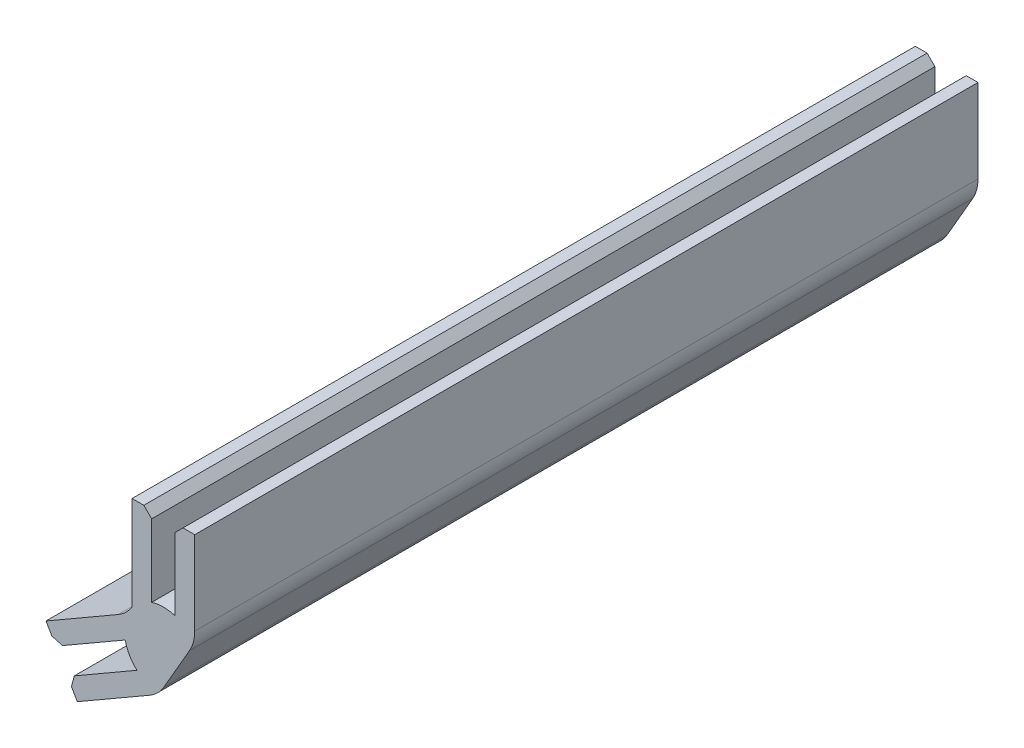
ISO-10303-21;
HEADER;
FILE_DESCRIPTION(('STEP AP214'),'2;1');
FILE_NAME('part.step','',(''),(''),'','','');
FILE_SCHEMA(('AUTOMOTIVE_DESIGN { 1 0 10303 214 1 1 1 1 }'));
ENDSEC;
DATA;
#1=APPLICATION_CONTEXT('core data for automotive mechanical design processes');
#2=APPLICATION_PROTOCOL_DEFINITION('international standard','automotive_design',2000,#1);
#3=PRODUCT_CONTEXT('',#1,'mechanical');
#4=PRODUCT('Part','Part','',(#3));
#5=PRODUCT_RELATED_PRODUCT_CATEGORY('part','',(#4));
#6=PRODUCT_DEFINITION_FORMATION('','',#4);
#7=PRODUCT_DEFINITION_CONTEXT('part definition',#1,'design');
#8=PRODUCT_DEFINITION('design','',#6,#7);
#9=PRODUCT_DEFINITION_SHAPE('','',#8);
#10=(LENGTH_UNIT() NAMED_UNIT(*) SI_UNIT(.MILLI.,.METRE.));
#11=(NAMED_UNIT(*) PLANE_ANGLE_UNIT() SI_UNIT($,.RADIAN.));
#12=(NAMED_UNIT(*) SI_UNIT($,.STERADIAN.) SOLID_ANGLE_UNIT());
#13=UNCERTAINTY_MEASURE_WITH_UNIT(LENGTH_MEASURE(1.E-05),#10,'distance_accuracy_value','');
#14=(GEOMETRIC_REPRESENTATION_CONTEXT(3) GLOBAL_UNCERTAINTY_ASSIGNED_CONTEXT((#13)) GLOBAL_UNIT_ASSIGNED_CONTEXT((#10,
#11,#12)) REPRESENTATION_CONTEXT('',''));
#15=CARTESIAN_POINT('',(0.,0.,0.));
#16=DIRECTION('',(0.,0.,1.));
#17=DIRECTION('',(1.,0.,0.));
#18=AXIS2_PLACEMENT_3D('',#15,#16,#17);
#19=CARTESIAN_POINT('',(0.,0.,100.));
#20=DIRECTION('',(0.,0.,-1.));
#21=DIRECTION('',(-1.,0.,0.));
#22=AXIS2_PLACEMENT_3D('',#19,#20,#21);
#23=CYLINDRICAL_SURFACE('',#22,5.);
#24=CARTESIAN_POINT('',(0.,0.,0.));
#25=DIRECTION('',(0.,0.,1.));
#26=DIRECTION('',(1.,0.,0.));
#27=AXIS2_PLACEMENT_3D('',#24,#25,#26);
#28=CIRCLE('',#27,5.);
#29=CARTESIAN_POINT('',(-4.,3.,0.));
#30=VERTEX_POINT('',#29);
#31=CARTESIAN_POINT('',(-4.1374586088177,2.80738958114478,0.));
#32=VERTEX_POINT('',#31);
#33=EDGE_CURVE('E260',#30,#32,#28,.T.);
#34=ORIENTED_EDGE('',*,*,#33,.T.);
#35=DIRECTION('',(0.,0.,-1.));
#36=VECTOR('',#35,1.);
#37=CARTESIAN_POINT('',(-4.1374586088177,2.80738958114478,100.));
#38=LINE('',#37,#36);
#39=CARTESIAN_POINT('',(-4.1374586088177,2.80738958114478,100.));
#40=VERTEX_POINT('',#39);
#41=EDGE_CURVE('E335',#32,#40,#38,.F.);
#42=ORIENTED_EDGE('',*,*,#41,.T.);
#43=CARTESIAN_POINT('',(0.,0.,100.));
#44=DIRECTION('',(0.,0.,1.));
#45=DIRECTION('',(1.,0.,0.));
#46=AXIS2_PLACEMENT_3D('',#43,#44,#45);
#47=CIRCLE('',#46,5.);
#48=CARTESIAN_POINT('',(-4.,3.,100.));
#49=VERTEX_POINT('',#48);
#50=EDGE_CURVE('E215',#49,#40,#47,.T.);
#51=ORIENTED_EDGE('',*,*,#50,.F.);
#52=DIRECTION('',(0.,0.,-1.));
#53=VECTOR('',#52,1.);
#54=CARTESIAN_POINT('',(-4.,3.,100.));
#55=LINE('',#54,#53);
#56=EDGE_CURVE('E257',#49,#30,#55,.T.);
#57=ORIENTED_EDGE('',*,*,#56,.T.);
#58=EDGE_LOOP('',(#34,#42,#51,#57));
#59=FACE_BOUND('',#58,.T.);
#60=ADVANCED_FACE('F43',(#59),#23,.T.);
#61=CARTESIAN_POINT('',(-4.59807621135333,1.96410161513773,100.));
#62=DIRECTION('',(0.500000000000004,-0.866025403784436,0.));
#63=DIRECTION('',(0.866025403784436,0.500000000000004,0.));
#64=AXIS2_PLACEMENT_3D('',#61,#62,#63);
#65=PLANE('',#64);
#66=DIRECTION('',(-0.866025403784436,-0.500000000000004,0.));
#67=VECTOR('',#66,1.);
#68=CARTESIAN_POINT('',(-4.59807621135333,1.96410161513773,100.));
#69=LINE('',#68,#67);
#70=CARTESIAN_POINT('',(-5.77491721763539,1.28465214336739,100.));
#71=VERTEX_POINT('',#70);
#72=CARTESIAN_POINT('',(-14.9903810567666,-4.03589838486232,100.));
#73=VERTEX_POINT('',#72);
#74=EDGE_CURVE('E197',#71,#73,#69,.T.);
#75=ORIENTED_EDGE('',*,*,#74,.F.);
#76=DIRECTION('',(0.,0.,1.));
#77=VECTOR('',#76,1.);
#78=CARTESIAN_POINT('',(-5.77491721763539,1.28465214336739,0.));
#79=LINE('',#78,#77);
#80=CARTESIAN_POINT('',(-5.77491721763539,1.28465214336739,0.));
#81=VERTEX_POINT('',#80);
#82=EDGE_CURVE('E329',#71,#81,#79,.F.);
#83=ORIENTED_EDGE('',*,*,#82,.T.);
#84=DIRECTION('',(-0.866025403784436,-0.500000000000004,0.));
#85=VECTOR('',#84,1.);
#86=CARTESIAN_POINT('',(-4.59807621135333,1.96410161513773,0.));
#87=LINE('',#86,#85);
#88=CARTESIAN_POINT('',(-14.9903810567666,-4.03589838486232,0.));
#89=VERTEX_POINT('',#88);
#90=EDGE_CURVE('E216',#81,#89,#87,.T.);
#91=ORIENTED_EDGE('',*,*,#90,.T.);
#92=DIRECTION('',(0.,0.,-1.));
#93=VECTOR('',#92,1.);
#94=CARTESIAN_POINT('',(-14.9903810567666,-4.03589838486232,100.));
#95=LINE('',#94,#93);
#96=EDGE_CURVE('E213',#73,#89,#95,.T.);
#97=ORIENTED_EDGE('',*,*,#96,.F.);
#98=EDGE_LOOP('',(#75,#83,#91,#97));
#99=FACE_BOUND('',#98,.T.);
#100=ADVANCED_FACE('F218',(#99),#65,.F.);
#101=CARTESIAN_POINT('',(-14.9903810567666,-4.03589838486232,100.));
#102=DIRECTION('',(0.866025403784436,0.500000000000004,0.));
#103=DIRECTION('',(-0.500000000000004,0.866025403784436,0.));
#104=AXIS2_PLACEMENT_3D('',#101,#102,#103);
#105=PLANE('',#104);
#106=DIRECTION('',(0.500000000000004,-0.866025403784436,0.));
#107=VECTOR('',#106,1.);
#108=CARTESIAN_POINT('',(-14.9903810567666,-4.03589838486232,0.));
#109=LINE('',#108,#107);
#110=CARTESIAN_POINT('',(-14.2403810567665,-5.33493649053899,0.));
#111=VERTEX_POINT('',#110);
#112=EDGE_CURVE('E265',#89,#111,#109,.T.);
#113=ORIENTED_EDGE('',*,*,#112,.T.);
#114=DIRECTION('',(0.,0.,1.));
#115=VECTOR('',#114,1.);
#116=CARTESIAN_POINT('',(-14.2403810567665,-5.33493649053899,100.));
#117=LINE('',#116,#115);
#118=CARTESIAN_POINT('',(-14.2403810567665,-5.33493649053899,100.));
#119=VERTEX_POINT('',#118);
#120=EDGE_CURVE('E11',#111,#119,#117,.T.);
#121=ORIENTED_EDGE('',*,*,#120,.T.);
#122=DIRECTION('',(0.500000000000004,-0.866025403784436,0.));
#123=VECTOR('',#122,1.);
#124=CARTESIAN_POINT('',(-14.9903810567666,-4.03589838486232,100.));
#125=LINE('',#124,#123);
#126=EDGE_CURVE('E204',#73,#119,#125,.T.);
#127=ORIENTED_EDGE('',*,*,#126,.F.);
#128=ORIENTED_EDGE('',*,*,#96,.T.);
#129=EDGE_LOOP('',(#113,#121,#127,#128));
#130=FACE_BOUND('',#129,.T.);
#131=ADVANCED_FACE('F222',(#130),#105,.F.);
#132=CARTESIAN_POINT('',(-4.88067791046457,-1.08580989786573,100.));
#133=DIRECTION('',(-0.500000000000004,0.866025403784436,0.));
#134=DIRECTION('',(-0.866025403784436,-0.500000000000004,0.));
#135=AXIS2_PLACEMENT_3D('',#132,#133,#134);
#136=PLANE('',#135);
#137=DIRECTION('',(0.866025403784436,0.500000000000004,0.));
#138=VECTOR('',#137,1.);
#139=CARTESIAN_POINT('',(-4.88067791046457,-1.08580989786573,100.));
#140=LINE('',#139,#138);
#141=CARTESIAN_POINT('',(-12.8743556529821,-5.70096189432342,100.));
#142=VERTEX_POINT('',#141);
#143=CARTESIAN_POINT('',(-4.88067791046457,-1.08580989786573,100.));
#144=VERTEX_POINT('',#143);
#145=EDGE_CURVE('E227',#142,#144,#140,.T.);
#146=ORIENTED_EDGE('',*,*,#145,.F.);
#147=DIRECTION('',(0.,0.,-1.));
#148=VECTOR('',#147,1.);
#149=CARTESIAN_POINT('',(-12.8743556529821,-5.70096189432342,100.));
#150=LINE('',#149,#148);
#151=CARTESIAN_POINT('',(-12.8743556529821,-5.70096189432342,0.));
#152=VERTEX_POINT('',#151);
#153=EDGE_CURVE('E55',#142,#152,#150,.T.);
#154=ORIENTED_EDGE('',*,*,#153,.T.);
#155=DIRECTION('',(0.866025403784436,0.500000000000004,0.));
#156=VECTOR('',#155,1.);
#157=CARTESIAN_POINT('',(-4.88067791046457,-1.08580989786573,0.));
#158=LINE('',#157,#156);
#159=CARTESIAN_POINT('',(-4.88067791046457,-1.08580989786573,0.));
#160=VERTEX_POINT('',#159);
#161=EDGE_CURVE('E262',#152,#160,#158,.T.);
#162=ORIENTED_EDGE('',*,*,#161,.T.);
#163=DIRECTION('',(0.,0.,-1.));
#164=VECTOR('',#163,1.);
#165=CARTESIAN_POINT('',(-4.88067791046457,-1.08580989786573,100.));
#166=LINE('',#165,#164);
#167=EDGE_CURVE('E221',#144,#160,#166,.T.);
#168=ORIENTED_EDGE('',*,*,#167,.F.);
#169=EDGE_LOOP('',(#146,#154,#162,#168));
#170=FACE_BOUND('',#169,.T.);
#171=ADVANCED_FACE('F369',(#170),#136,.F.);
#172=CARTESIAN_POINT('',(0.,0.,100.));
#173=DIRECTION('',(0.,0.,-1.));
#174=DIRECTION('',(-1.,0.,0.));
#175=AXIS2_PLACEMENT_3D('',#172,#173,#174);
#176=CYLINDRICAL_SURFACE('',#175,5.);
#177=CARTESIAN_POINT('',(0.,0.,0.));
#178=DIRECTION('',(0.,0.,1.));
#179=DIRECTION('',(1.,0.,0.));
#180=AXIS2_PLACEMENT_3D('',#177,#178,#179);
#181=CIRCLE('',#180,5.);
#182=CARTESIAN_POINT('',(-3.38067791046456,-3.68388610921904,0.));
#183=VERTEX_POINT('',#182);
#184=EDGE_CURVE('E268',#160,#183,#181,.T.);
#185=ORIENTED_EDGE('',*,*,#184,.T.);
#186=DIRECTION('',(0.,0.,-1.));
#187=VECTOR('',#186,1.);
#188=CARTESIAN_POINT('',(-3.38067791046456,-3.68388610921904,100.));
#189=LINE('',#188,#187);
#190=CARTESIAN_POINT('',(-3.38067791046456,-3.68388610921904,100.));
#191=VERTEX_POINT('',#190);
#192=EDGE_CURVE('E308',#191,#183,#189,.T.);
#193=ORIENTED_EDGE('',*,*,#192,.F.);
#194=CARTESIAN_POINT('',(0.,0.,100.));
#195=DIRECTION('',(0.,0.,1.));
#196=DIRECTION('',(1.,0.,0.));
#197=AXIS2_PLACEMENT_3D('',#194,#195,#196);
#198=CIRCLE('',#197,5.);
#199=EDGE_CURVE('E230',#144,#191,#198,.T.);
#200=ORIENTED_EDGE('',*,*,#199,.F.);
#201=ORIENTED_EDGE('',*,*,#167,.T.);
#202=EDGE_LOOP('',(#185,#193,#200,#201));
#203=FACE_BOUND('',#202,.T.);
#204=ADVANCED_FACE('F379',(#203),#176,.T.);
#205=CARTESIAN_POINT('',(-3.38067791046456,-3.68388610921904,100.));
#206=DIRECTION('',(0.500000000000004,-0.866025403784436,0.));
#207=DIRECTION('',(0.866025403784436,0.500000000000004,0.));
#208=AXIS2_PLACEMENT_3D('',#205,#206,#207);
#209=PLANE('',#208);
#210=DIRECTION('',(-0.866025403784436,-0.500000000000004,0.));
#211=VECTOR('',#210,1.);
#212=CARTESIAN_POINT('',(-3.38067791046456,-3.68388610921904,0.));
#213=LINE('',#212,#211);
#214=CARTESIAN_POINT('',(-11.3743556529821,-8.29903810567671,0.));
#215=VERTEX_POINT('',#214);
#216=EDGE_CURVE('E266',#183,#215,#213,.T.);
#217=ORIENTED_EDGE('',*,*,#216,.T.);
#218=DIRECTION('',(0.,0.,1.));
#219=VECTOR('',#218,1.);
#220=CARTESIAN_POINT('',(-11.3743556529821,-8.29903810567671,100.));
#221=LINE('',#220,#219);
#222=CARTESIAN_POINT('',(-11.3743556529821,-8.29903810567671,100.));
#223=VERTEX_POINT('',#222);
#224=EDGE_CURVE('E70',#215,#223,#221,.T.);
#225=ORIENTED_EDGE('',*,*,#224,.T.);
#226=DIRECTION('',(-0.866025403784436,-0.500000000000004,0.));
#227=VECTOR('',#226,1.);
#228=CARTESIAN_POINT('',(-3.38067791046456,-3.68388610921904,100.));
#229=LINE('',#228,#227);
#230=EDGE_CURVE('E234',#191,#223,#229,.T.);
#231=ORIENTED_EDGE('',*,*,#230,.F.);
#232=ORIENTED_EDGE('',*,*,#192,.T.);
#233=EDGE_LOOP('',(#217,#225,#231,#232));
#234=FACE_BOUND('',#233,.T.);
#235=ADVANCED_FACE('F385',(#234),#209,.F.);
#236=CARTESIAN_POINT('',(-10.9903810567665,-10.9641016151378,100.));
#237=DIRECTION('',(0.866025403784436,0.500000000000004,0.));
#238=DIRECTION('',(-0.500000000000004,0.866025403784437,0.));
#239=AXIS2_PLACEMENT_3D('',#236,#237,#238);
#240=PLANE('',#239);
#241=DIRECTION('',(0.500000000000004,-0.866025403784436,0.));
#242=VECTOR('',#241,1.);
#243=CARTESIAN_POINT('',(-10.9903810567665,-10.9641016151378,100.));
#244=LINE('',#243,#242);
#245=CARTESIAN_POINT('',(-11.7403810567665,-9.66506350946115,100.));
#246=VERTEX_POINT('',#245);
#247=CARTESIAN_POINT('',(-10.9903810567665,-10.9641016151378,100.));
#248=VERTEX_POINT('',#247);
#249=EDGE_CURVE('E236',#246,#248,#244,.T.);
#250=ORIENTED_EDGE('',*,*,#249,.F.);
#251=DIRECTION('',(0.,0.,-1.));
#252=VECTOR('',#251,1.);
#253=CARTESIAN_POINT('',(-11.7403810567665,-9.66506350946115,100.));
#254=LINE('',#253,#252);
#255=CARTESIAN_POINT('',(-11.7403810567665,-9.66506350946115,0.));
#256=VERTEX_POINT('',#255);
#257=EDGE_CURVE('E365',#246,#256,#254,.T.);
#258=ORIENTED_EDGE('',*,*,#257,.T.);
#259=DIRECTION('',(0.500000000000004,-0.866025403784436,0.));
#260=VECTOR('',#259,1.);
#261=CARTESIAN_POINT('',(-10.9903810567665,-10.9641016151378,0.));
#262=LINE('',#261,#260);
#263=CARTESIAN_POINT('',(-10.9903810567665,-10.9641016151378,0.));
#264=VERTEX_POINT('',#263);
#265=EDGE_CURVE('E267',#256,#264,#262,.T.);
#266=ORIENTED_EDGE('',*,*,#265,.T.);
#267=DIRECTION('',(0.,0.,-1.));
#268=VECTOR('',#267,1.);
#269=CARTESIAN_POINT('',(-10.9903810567665,-10.9641016151378,100.));
#270=LINE('',#269,#268);
#271=EDGE_CURVE('E304',#248,#264,#270,.T.);
#272=ORIENTED_EDGE('',*,*,#271,.F.);
#273=EDGE_LOOP('',(#250,#258,#266,#272));
#274=FACE_BOUND('',#273,.T.);
#275=ADVANCED_FACE('F389',(#274),#240,.F.);
#276=CARTESIAN_POINT('',(-0.598076211353293,-4.96410161513776,100.));
#277=DIRECTION('',(-0.500000000000004,0.866025403784436,0.));
#278=DIRECTION('',(-0.866025403784436,-0.500000000000004,0.));
#279=AXIS2_PLACEMENT_3D('',#276,#277,#278);
#280=PLANE('',#279);
#281=DIRECTION('',(0.866025403784436,0.500000000000004,0.));
#282=VECTOR('',#281,1.);
#283=CARTESIAN_POINT('',(-0.598076211353293,-4.96410161513776,0.));
#284=LINE('',#283,#282);
#285=CARTESIAN_POINT('',(-1.75833024919767,-5.63397459621557,0.));
#286=VERTEX_POINT('',#285);
#287=EDGE_CURVE('E275',#264,#286,#284,.T.);
#288=ORIENTED_EDGE('',*,*,#287,.T.);
#289=DIRECTION('',(0.,0.,-1.));
#290=VECTOR('',#289,1.);
#291=CARTESIAN_POINT('',(-1.75833024919767,-5.63397459621557,100.));
#292=LINE('',#291,#290);
#293=CARTESIAN_POINT('',(-1.75833024919767,-5.63397459621557,100.));
#294=VERTEX_POINT('',#293);
#295=EDGE_CURVE('E322',#286,#294,#292,.F.);
#296=ORIENTED_EDGE('',*,*,#295,.T.);
#297=DIRECTION('',(0.866025403784436,0.500000000000004,0.));
#298=VECTOR('',#297,1.);
#299=CARTESIAN_POINT('',(-0.598076211353293,-4.96410161513776,100.));
#300=LINE('',#299,#298);
#301=EDGE_CURVE('E238',#248,#294,#300,.T.);
#302=ORIENTED_EDGE('',*,*,#301,.F.);
#303=ORIENTED_EDGE('',*,*,#271,.T.);
#304=EDGE_LOOP('',(#288,#296,#302,#303));
#305=FACE_BOUND('',#304,.T.);
#306=ADVANCED_FACE('F392',(#305),#280,.F.);
#307=CARTESIAN_POINT('',(4.,3.,100.));
#308=DIRECTION('',(-1.,0.,0.));
#309=DIRECTION('',(0.,0.,1.));
#310=AXIS2_PLACEMENT_3D('',#307,#308,#309);
#311=PLANE('',#310);
#312=DIRECTION('',(0.,1.,0.));
#313=VECTOR('',#312,1.);
#314=CARTESIAN_POINT('',(4.,3.,100.));
#315=LINE('',#314,#313);
#316=CARTESIAN_POINT('',(4.,4.33974596215561,100.));
#317=VERTEX_POINT('',#316);
#318=CARTESIAN_POINT('',(4.,15.,100.));
#319=VERTEX_POINT('',#318);
#320=EDGE_CURVE('E241',#317,#319,#315,.T.);
#321=ORIENTED_EDGE('',*,*,#320,.F.);
#322=DIRECTION('',(0.,0.,-1.));
#323=VECTOR('',#322,1.);
#324=CARTESIAN_POINT('',(4.,4.33974596215561,100.));
#325=LINE('',#324,#323);
#326=CARTESIAN_POINT('',(4.,4.33974596215561,0.));
#327=VERTEX_POINT('',#326);
#328=EDGE_CURVE('E330',#317,#327,#325,.T.);
#329=ORIENTED_EDGE('',*,*,#328,.T.);
#330=DIRECTION('',(0.,1.,0.));
#331=VECTOR('',#330,1.);
#332=CARTESIAN_POINT('',(4.,3.,0.));
#333=LINE('',#332,#331);
#334=CARTESIAN_POINT('',(4.,15.,0.));
#335=VERTEX_POINT('',#334);
#336=EDGE_CURVE('E273',#327,#335,#333,.T.);
#337=ORIENTED_EDGE('',*,*,#336,.T.);
#338=DIRECTION('',(0.,0.,-1.));
#339=VECTOR('',#338,1.);
#340=CARTESIAN_POINT('',(4.,15.,100.));
#341=LINE('',#340,#339);
#342=EDGE_CURVE('E305',#319,#335,#341,.T.);
#343=ORIENTED_EDGE('',*,*,#342,.F.);
#344=EDGE_LOOP('',(#321,#329,#337,#343));
#345=FACE_BOUND('',#344,.T.);
#346=ADVANCED_FACE('F494',(#345),#311,.F.);
#347=CARTESIAN_POINT('',(4.,15.,100.));
#348=DIRECTION('',(0.,-1.,0.));
#349=DIRECTION('',(0.,0.,-1.));
#350=AXIS2_PLACEMENT_3D('',#347,#348,#349);
#351=PLANE('',#350);
#352=DIRECTION('',(-1.,0.,0.));
#353=VECTOR('',#352,1.);
#354=CARTESIAN_POINT('',(4.,15.,0.));
#355=LINE('',#354,#353);
#356=CARTESIAN_POINT('',(2.49999999999999,15.,0.));
#357=VERTEX_POINT('',#356);
#358=EDGE_CURVE('E280',#335,#357,#355,.T.);
#359=ORIENTED_EDGE('',*,*,#358,.T.);
#360=DIRECTION('',(0.,0.,1.));
#361=VECTOR('',#360,1.);
#362=CARTESIAN_POINT('',(2.49999999999999,15.,100.));
#363=LINE('',#362,#361);
#364=CARTESIAN_POINT('',(2.49999999999999,15.,100.));
#365=VERTEX_POINT('',#364);
#366=EDGE_CURVE('E346',#357,#365,#363,.T.);
#367=ORIENTED_EDGE('',*,*,#366,.T.);
#368=DIRECTION('',(-1.,0.,0.));
#369=VECTOR('',#368,1.);
#370=CARTESIAN_POINT('',(4.,15.,100.));
#371=LINE('',#370,#369);
#372=EDGE_CURVE('E243',#319,#365,#371,.T.);
#373=ORIENTED_EDGE('',*,*,#372,.F.);
#374=ORIENTED_EDGE('',*,*,#342,.T.);
#375=EDGE_LOOP('',(#359,#367,#373,#374));
#376=FACE_BOUND('',#375,.T.);
#377=ADVANCED_FACE('F490',(#376),#351,.F.);
#378=CARTESIAN_POINT('',(1.5,4.76969600708473,100.));
#379=DIRECTION('',(1.,0.,0.));
#380=DIRECTION('',(0.,0.,-1.));
#381=AXIS2_PLACEMENT_3D('',#378,#379,#380);
#382=PLANE('',#381);
#383=DIRECTION('',(0.,-1.,0.));
#384=VECTOR('',#383,1.);
#385=CARTESIAN_POINT('',(1.5,4.76969600708473,100.));
#386=LINE('',#385,#384);
#387=CARTESIAN_POINT('',(1.5,14.,100.));
#388=VERTEX_POINT('',#387);
#389=CARTESIAN_POINT('',(1.5,4.76969600708473,100.));
#390=VERTEX_POINT('',#389);
#391=EDGE_CURVE('E244',#388,#390,#386,.T.);
#392=ORIENTED_EDGE('',*,*,#391,.F.);
#393=DIRECTION('',(0.,0.,-1.));
#394=VECTOR('',#393,1.);
#395=CARTESIAN_POINT('',(1.5,14.,100.));
#396=LINE('',#395,#394);
#397=CARTESIAN_POINT('',(1.5,14.,0.));
#398=VERTEX_POINT('',#397);
#399=EDGE_CURVE('E340',#388,#398,#396,.T.);
#400=ORIENTED_EDGE('',*,*,#399,.T.);
#401=DIRECTION('',(0.,-1.,0.));
#402=VECTOR('',#401,1.);
#403=CARTESIAN_POINT('',(1.5,4.76969600708473,0.));
#404=LINE('',#403,#402);
#405=CARTESIAN_POINT('',(1.5,4.76969600708473,0.));
#406=VERTEX_POINT('',#405);
#407=EDGE_CURVE('E278',#398,#406,#404,.T.);
#408=ORIENTED_EDGE('',*,*,#407,.T.);
#409=DIRECTION('',(0.,0.,-1.));
#410=VECTOR('',#409,1.);
#411=CARTESIAN_POINT('',(1.5,4.76969600708473,100.));
#412=LINE('',#411,#410);
#413=EDGE_CURVE('E299',#390,#406,#412,.T.);
#414=ORIENTED_EDGE('',*,*,#413,.F.);
#415=EDGE_LOOP('',(#392,#400,#408,#414));
#416=FACE_BOUND('',#415,.T.);
#417=ADVANCED_FACE('F481',(#416),#382,.F.);
#418=CARTESIAN_POINT('',(0.,0.,100.));
#419=DIRECTION('',(0.,0.,-1.));
#420=DIRECTION('',(-1.,0.,0.));
#421=AXIS2_PLACEMENT_3D('',#418,#419,#420);
#422=CYLINDRICAL_SURFACE('',#421,5.);
#423=CARTESIAN_POINT('',(0.,0.,0.));
#424=DIRECTION('',(0.,0.,1.));
#425=DIRECTION('',(1.,0.,0.));
#426=AXIS2_PLACEMENT_3D('',#423,#424,#425);
#427=CIRCLE('',#426,5.);
#428=CARTESIAN_POINT('',(-1.5,4.76969600708473,0.));
#429=VERTEX_POINT('',#428);
#430=EDGE_CURVE('E285',#406,#429,#427,.T.);
#431=ORIENTED_EDGE('',*,*,#430,.T.);
#432=DIRECTION('',(0.,0.,-1.));
#433=VECTOR('',#432,1.);
#434=CARTESIAN_POINT('',(-1.5,4.76969600708473,100.));
#435=LINE('',#434,#433);
#436=CARTESIAN_POINT('',(-1.5,4.76969600708473,100.));
#437=VERTEX_POINT('',#436);
#438=EDGE_CURVE('E298',#437,#429,#435,.T.);
#439=ORIENTED_EDGE('',*,*,#438,.F.);
#440=CARTESIAN_POINT('',(0.,0.,100.));
#441=DIRECTION('',(0.,0.,1.));
#442=DIRECTION('',(1.,0.,0.));
#443=AXIS2_PLACEMENT_3D('',#440,#441,#442);
#444=CIRCLE('',#443,5.);
#445=EDGE_CURVE('E250',#390,#437,#444,.T.);
#446=ORIENTED_EDGE('',*,*,#445,.F.);
#447=ORIENTED_EDGE('',*,*,#413,.T.);
#448=EDGE_LOOP('',(#431,#439,#446,#447));
#449=FACE_BOUND('',#448,.T.);
#450=ADVANCED_FACE('F476',(#449),#422,.T.);
#451=CARTESIAN_POINT('',(-1.5,4.76969600708473,100.));
#452=DIRECTION('',(-1.,0.,0.));
#453=DIRECTION('',(0.,0.,1.));
#454=AXIS2_PLACEMENT_3D('',#451,#452,#453);
#455=PLANE('',#454);
#456=DIRECTION('',(0.,1.,0.));
#457=VECTOR('',#456,1.);
#458=CARTESIAN_POINT('',(-1.5,4.76969600708473,0.));
#459=LINE('',#458,#457);
#460=CARTESIAN_POINT('',(-1.5,14.,0.));
#461=VERTEX_POINT('',#460);
#462=EDGE_CURVE('E282',#429,#461,#459,.T.);
#463=ORIENTED_EDGE('',*,*,#462,.T.);
#464=DIRECTION('',(0.,0.,1.));
#465=VECTOR('',#464,1.);
#466=CARTESIAN_POINT('',(-1.5,14.,100.));
#467=LINE('',#466,#465);
#468=CARTESIAN_POINT('',(-1.5,14.,100.));
#469=VERTEX_POINT('',#468);
#470=EDGE_CURVE('E359',#461,#469,#467,.T.);
#471=ORIENTED_EDGE('',*,*,#470,.T.);
#472=DIRECTION('',(0.,1.,0.));
#473=VECTOR('',#472,1.);
#474=CARTESIAN_POINT('',(-1.5,4.76969600708473,100.));
#475=LINE('',#474,#473);
#476=EDGE_CURVE('E248',#437,#469,#475,.T.);
#477=ORIENTED_EDGE('',*,*,#476,.F.);
#478=ORIENTED_EDGE('',*,*,#438,.T.);
#479=EDGE_LOOP('',(#463,#471,#477,#478));
#480=FACE_BOUND('',#479,.T.);
#481=ADVANCED_FACE('F471',(#480),#455,.F.);
#482=CARTESIAN_POINT('',(-4.,15.,100.));
#483=DIRECTION('',(0.,-1.,0.));
#484=DIRECTION('',(0.,0.,-1.));
#485=AXIS2_PLACEMENT_3D('',#482,#483,#484);
#486=PLANE('',#485);
#487=DIRECTION('',(-1.,0.,0.));
#488=VECTOR('',#487,1.);
#489=CARTESIAN_POINT('',(-4.,15.,100.));
#490=LINE('',#489,#488);
#491=CARTESIAN_POINT('',(-2.49999999999999,15.,100.));
#492=VERTEX_POINT('',#491);
#493=CARTESIAN_POINT('',(-4.,15.,100.));
#494=VERTEX_POINT('',#493);
#495=EDGE_CURVE('E255',#492,#494,#490,.T.);
#496=ORIENTED_EDGE('',*,*,#495,.F.);
#497=DIRECTION('',(0.,0.,-1.));
#498=VECTOR('',#497,1.);
#499=CARTESIAN_POINT('',(-2.49999999999999,15.,100.));
#500=LINE('',#499,#498);
#501=CARTESIAN_POINT('',(-2.49999999999999,15.,0.));
#502=VERTEX_POINT('',#501);
#503=EDGE_CURVE('E357',#492,#502,#500,.T.);
#504=ORIENTED_EDGE('',*,*,#503,.T.);
#505=DIRECTION('',(-1.,0.,0.));
#506=VECTOR('',#505,1.);
#507=CARTESIAN_POINT('',(-4.,15.,0.));
#508=LINE('',#507,#506);
#509=CARTESIAN_POINT('',(-4.,15.,0.));
#510=VERTEX_POINT('',#509);
#511=EDGE_CURVE('E290',#502,#510,#508,.T.);
#512=ORIENTED_EDGE('',*,*,#511,.T.);
#513=DIRECTION('',(0.,0.,-1.));
#514=VECTOR('',#513,1.);
#515=CARTESIAN_POINT('',(-4.,15.,100.));
#516=LINE('',#515,#514);
#517=EDGE_CURVE('E291',#494,#510,#516,.T.);
#518=ORIENTED_EDGE('',*,*,#517,.F.);
#519=EDGE_LOOP('',(#496,#504,#512,#518));
#520=FACE_BOUND('',#519,.T.);
#521=ADVANCED_FACE('F467',(#520),#486,.F.);
#522=CARTESIAN_POINT('',(-4.,3.,100.));
#523=DIRECTION('',(1.,0.,0.));
#524=DIRECTION('',(0.,0.,-1.));
#525=AXIS2_PLACEMENT_3D('',#522,#523,#524);
#526=PLANE('',#525);
#527=DIRECTION('',(0.,-1.,0.));
#528=VECTOR('',#527,1.);
#529=CARTESIAN_POINT('',(-4.,3.,0.));
#530=LINE('',#529,#528);
#531=EDGE_CURVE('E289',#510,#30,#530,.T.);
#532=ORIENTED_EDGE('',*,*,#531,.T.);
#533=ORIENTED_EDGE('',*,*,#56,.F.);
#534=DIRECTION('',(0.,-1.,0.));
#535=VECTOR('',#534,1.);
#536=CARTESIAN_POINT('',(-4.,3.,100.));
#537=LINE('',#536,#535);
#538=EDGE_CURVE('E251',#494,#49,#537,.T.);
#539=ORIENTED_EDGE('',*,*,#538,.F.);
#540=ORIENTED_EDGE('',*,*,#517,.T.);
#541=EDGE_LOOP('',(#532,#533,#539,#540));
#542=FACE_BOUND('',#541,.T.);
#543=ADVANCED_FACE('F468',(#542),#526,.F.);
#544=CARTESIAN_POINT('',(0.,0.,100.));
#545=DIRECTION('',(0.,0.,1.));
#546=DIRECTION('',(1.,0.,0.));
#547=AXIS2_PLACEMENT_3D('',#544,#545,#546);
#548=PLANE('',#547);
#549=ORIENTED_EDGE('',*,*,#372,.T.);
#550=DIRECTION('',(0.707106781186548,0.707106781186548,0.));
#551=VECTOR('',#550,1.);
#552=CARTESIAN_POINT('',(-6.25000000000001,6.25000000000001,100.));
#553=LINE('',#552,#551);
#554=EDGE_CURVE('E352',#365,#388,#553,.F.);
#555=ORIENTED_EDGE('',*,*,#554,.T.);
#556=ORIENTED_EDGE('',*,*,#391,.T.);
#557=ORIENTED_EDGE('',*,*,#445,.T.);
#558=ORIENTED_EDGE('',*,*,#476,.T.);
#559=DIRECTION('',(0.707106781186548,-0.707106781186548,0.));
#560=VECTOR('',#559,1.);
#561=CARTESIAN_POINT('',(6.25000000000001,6.25000000000001,100.));
#562=LINE('',#561,#560);
#563=EDGE_CURVE('E351',#469,#492,#562,.F.);
#564=ORIENTED_EDGE('',*,*,#563,.T.);
#565=ORIENTED_EDGE('',*,*,#495,.T.);
#566=ORIENTED_EDGE('',*,*,#538,.T.);
#567=ORIENTED_EDGE('',*,*,#50,.T.);
#568=CARTESIAN_POINT('',(-8.27491721763541,5.61477916228957,100.));
#569=DIRECTION('',(0.,0.,1.));
#570=DIRECTION('',(1.,0.,0.));
#571=AXIS2_PLACEMENT_3D('',#568,#569,#570);
#572=CIRCLE('',#571,5.);
#573=EDGE_CURVE('E206',#40,#71,#572,.F.);
#574=ORIENTED_EDGE('',*,*,#573,.T.);
#575=ORIENTED_EDGE('',*,*,#74,.T.);
#576=ORIENTED_EDGE('',*,*,#126,.T.);
#577=DIRECTION('',(-0.965925826289068,0.258819045102521,0.));
#578=VECTOR('',#577,1.);
#579=CARTESIAN_POINT('',(-2.28765877365277,-8.53765877365282,100.));
#580=LINE('',#579,#578);
#581=EDGE_CURVE('E349',#119,#142,#580,.F.);
#582=ORIENTED_EDGE('',*,*,#581,.T.);
#583=ORIENTED_EDGE('',*,*,#145,.T.);
#584=ORIENTED_EDGE('',*,*,#199,.T.);
#585=ORIENTED_EDGE('',*,*,#230,.T.);
#586=DIRECTION('',(0.25881904510252,0.965925826289068,0.));
#587=VECTOR('',#586,1.);
#588=CARTESIAN_POINT('',(-8.53765877365269,2.28765877365272,100.));
#589=LINE('',#588,#587);
#590=EDGE_CURVE('E56',#223,#246,#589,.F.);
#591=ORIENTED_EDGE('',*,*,#590,.T.);
#592=ORIENTED_EDGE('',*,*,#249,.T.);
#593=ORIENTED_EDGE('',*,*,#301,.T.);
#594=CARTESIAN_POINT('',(-4.25833024919769,-1.30384757729339,100.));
#595=DIRECTION('',(0.,0.,1.));
#596=DIRECTION('',(1.,0.,0.));
#597=AXIS2_PLACEMENT_3D('',#594,#595,#596);
#598=CIRCLE('',#597,5.);
#599=CARTESIAN_POINT('',(0.0717967697245088,-3.80384757729337,100.));
#600=VERTEX_POINT('',#599);
#601=EDGE_CURVE('E323',#294,#600,#598,.T.);
#602=ORIENTED_EDGE('',*,*,#601,.T.);
#603=DIRECTION('',(-0.499999999999998,-0.86602540378444,0.));
#604=VECTOR('',#603,1.);
#605=CARTESIAN_POINT('',(4.,3.,100.));
#606=LINE('',#605,#604);
#607=CARTESIAN_POINT('',(3.3301270189222,1.83974596215562,100.));
#608=VERTEX_POINT('',#607);
#609=EDGE_CURVE('E405',#608,#600,#606,.T.);
#610=ORIENTED_EDGE('',*,*,#609,.F.);
#611=CARTESIAN_POINT('',(-1.,4.33974596215561,100.));
#612=DIRECTION('',(0.,0.,1.));
#613=DIRECTION('',(1.,0.,0.));
#614=AXIS2_PLACEMENT_3D('',#611,#612,#613);
#615=CIRCLE('',#614,5.);
#616=EDGE_CURVE('E324',#608,#317,#615,.T.);
#617=ORIENTED_EDGE('',*,*,#616,.T.);
#618=ORIENTED_EDGE('',*,*,#320,.T.);
#619=EDGE_LOOP('',(#549,#555,#556,#557,#558,#564,#565,#566,#567,#574,#575,#576,#582,#583,#584,
#585,#591,#592,#593,#602,#610,#617,#618));
#620=FACE_BOUND('',#619,.T.);
#621=ADVANCED_FACE('F205',(#620),#548,.T.);
#622=CARTESIAN_POINT('',(0.,0.,0.));
#623=DIRECTION('',(0.,0.,1.));
#624=DIRECTION('',(1.,0.,0.));
#625=AXIS2_PLACEMENT_3D('',#622,#623,#624);
#626=PLANE('',#625);
#627=ORIENTED_EDGE('',*,*,#407,.F.);
#628=DIRECTION('',(-0.707106781186548,-0.707106781186548,0.));
#629=VECTOR('',#628,1.);
#630=CARTESIAN_POINT('',(1.5,14.,0.));
#631=LINE('',#630,#629);
#632=EDGE_CURVE('E348',#398,#357,#631,.F.);
#633=ORIENTED_EDGE('',*,*,#632,.T.);
#634=ORIENTED_EDGE('',*,*,#358,.F.);
#635=ORIENTED_EDGE('',*,*,#336,.F.);
#636=CARTESIAN_POINT('',(-1.,4.33974596215561,0.));
#637=DIRECTION('',(0.,0.,1.));
#638=DIRECTION('',(1.,0.,0.));
#639=AXIS2_PLACEMENT_3D('',#636,#637,#638);
#640=CIRCLE('',#639,5.);
#641=CARTESIAN_POINT('',(3.3301270189222,1.83974596215562,0.));
#642=VERTEX_POINT('',#641);
#643=EDGE_CURVE('E320',#327,#642,#640,.F.);
#644=ORIENTED_EDGE('',*,*,#643,.T.);
#645=DIRECTION('',(-0.499999999999998,-0.86602540378444,0.));
#646=VECTOR('',#645,1.);
#647=CARTESIAN_POINT('',(4.,3.,0.));
#648=LINE('',#647,#646);
#649=CARTESIAN_POINT('',(0.0717967697245088,-3.80384757729337,0.));
#650=VERTEX_POINT('',#649);
#651=EDGE_CURVE('E258',#642,#650,#648,.T.);
#652=ORIENTED_EDGE('',*,*,#651,.T.);
#653=CARTESIAN_POINT('',(-4.25833024919769,-1.30384757729339,0.));
#654=DIRECTION('',(0.,0.,1.));
#655=DIRECTION('',(1.,0.,0.));
#656=AXIS2_PLACEMENT_3D('',#653,#654,#655);
#657=CIRCLE('',#656,5.);
#658=EDGE_CURVE('E316',#650,#286,#657,.F.);
#659=ORIENTED_EDGE('',*,*,#658,.T.);
#660=ORIENTED_EDGE('',*,*,#287,.F.);
#661=ORIENTED_EDGE('',*,*,#265,.F.);
#662=DIRECTION('',(-0.25881904510252,-0.965925826289068,0.));
#663=VECTOR('',#662,1.);
#664=CARTESIAN_POINT('',(-11.7403810567665,-9.66506350946115,0.));
#665=LINE('',#664,#663);
#666=EDGE_CURVE('E345',#256,#215,#665,.F.);
#667=ORIENTED_EDGE('',*,*,#666,.T.);
#668=ORIENTED_EDGE('',*,*,#216,.F.);
#669=ORIENTED_EDGE('',*,*,#184,.F.);
#670=ORIENTED_EDGE('',*,*,#161,.F.);
#671=DIRECTION('',(0.965925826289068,-0.258819045102521,0.));
#672=VECTOR('',#671,1.);
#673=CARTESIAN_POINT('',(-12.8743556529821,-5.70096189432342,0.));
#674=LINE('',#673,#672);
#675=EDGE_CURVE('E338',#152,#111,#674,.F.);
#676=ORIENTED_EDGE('',*,*,#675,.T.);
#677=ORIENTED_EDGE('',*,*,#112,.F.);
#678=ORIENTED_EDGE('',*,*,#90,.F.);
#679=CARTESIAN_POINT('',(-8.27491721763541,5.61477916228957,0.));
#680=DIRECTION('',(0.,0.,1.));
#681=DIRECTION('',(1.,0.,0.));
#682=AXIS2_PLACEMENT_3D('',#679,#680,#681);
#683=CIRCLE('',#682,5.);
#684=EDGE_CURVE('E334',#81,#32,#683,.T.);
#685=ORIENTED_EDGE('',*,*,#684,.T.);
#686=ORIENTED_EDGE('',*,*,#33,.F.);
#687=ORIENTED_EDGE('',*,*,#531,.F.);
#688=ORIENTED_EDGE('',*,*,#511,.F.);
#689=DIRECTION('',(-0.707106781186548,0.707106781186548,0.));
#690=VECTOR('',#689,1.);
#691=CARTESIAN_POINT('',(-2.49999999999999,15.,0.));
#692=LINE('',#691,#690);
#693=EDGE_CURVE('E341',#502,#461,#692,.F.);
#694=ORIENTED_EDGE('',*,*,#693,.T.);
#695=ORIENTED_EDGE('',*,*,#462,.F.);
#696=ORIENTED_EDGE('',*,*,#430,.F.);
#697=EDGE_LOOP('',(#627,#633,#634,#635,#644,#652,#659,#660,#661,#667,#668,#669,#670,#676,#677,
#678,#685,#686,#687,#688,#694,#695,#696));
#698=FACE_BOUND('',#697,.T.);
#699=ADVANCED_FACE('F376',(#698),#626,.F.);
#700=CARTESIAN_POINT('',(4.,3.,0.));
#701=DIRECTION('',(-0.86602540378444,0.499999999999998,0.));
#702=DIRECTION('',(-0.499999999999998,-0.86602540378444,0.));
#703=AXIS2_PLACEMENT_3D('',#700,#701,#702);
#704=PLANE('',#703);
#705=ORIENTED_EDGE('',*,*,#609,.T.);
#706=DIRECTION('',(0.,0.,-1.));
#707=VECTOR('',#706,1.);
#708=CARTESIAN_POINT('',(0.0717967697245079,-3.80384757729338,0.));
#709=LINE('',#708,#707);
#710=EDGE_CURVE('E313',#600,#650,#709,.T.);
#711=ORIENTED_EDGE('',*,*,#710,.T.);
#712=ORIENTED_EDGE('',*,*,#651,.F.);
#713=DIRECTION('',(0.,0.,-1.));
#714=VECTOR('',#713,1.);
#715=CARTESIAN_POINT('',(3.3301270189222,1.83974596215562,0.));
#716=LINE('',#715,#714);
#717=EDGE_CURVE('E225',#642,#608,#716,.F.);
#718=ORIENTED_EDGE('',*,*,#717,.T.);
#719=EDGE_LOOP('',(#705,#711,#712,#718));
#720=FACE_BOUND('',#719,.T.);
#721=ADVANCED_FACE('F403',(#720),#704,.F.);
#722=CARTESIAN_POINT('',(-4.25833024919769,-1.30384757729339,0.));
#723=DIRECTION('',(0.,0.,-1.));
#724=DIRECTION('',(-1.,0.,0.));
#725=AXIS2_PLACEMENT_3D('',#722,#723,#724);
#726=CYLINDRICAL_SURFACE('',#725,5.);
#727=ORIENTED_EDGE('',*,*,#601,.F.);
#728=ORIENTED_EDGE('',*,*,#295,.F.);
#729=ORIENTED_EDGE('',*,*,#658,.F.);
#730=ORIENTED_EDGE('',*,*,#710,.F.);
#731=EDGE_LOOP('',(#727,#728,#729,#730));
#732=FACE_BOUND('',#731,.T.);
#733=ADVANCED_FACE('F396',(#732),#726,.T.);
#734=CARTESIAN_POINT('',(-1.,4.33974596215561,100.));
#735=DIRECTION('',(0.,0.,-1.));
#736=DIRECTION('',(-1.,0.,0.));
#737=AXIS2_PLACEMENT_3D('',#734,#735,#736);
#738=CYLINDRICAL_SURFACE('',#737,5.);
#739=ORIENTED_EDGE('',*,*,#616,.F.);
#740=ORIENTED_EDGE('',*,*,#717,.F.);
#741=ORIENTED_EDGE('',*,*,#643,.F.);
#742=ORIENTED_EDGE('',*,*,#328,.F.);
#743=EDGE_LOOP('',(#739,#740,#741,#742));
#744=FACE_BOUND('',#743,.T.);
#745=ADVANCED_FACE('F432',(#744),#738,.T.);
#746=CARTESIAN_POINT('',(-8.27491721763541,5.61477916228957,100.));
#747=DIRECTION('',(0.,0.,-1.));
#748=DIRECTION('',(-1.,0.,0.));
#749=AXIS2_PLACEMENT_3D('',#746,#747,#748);
#750=CYLINDRICAL_SURFACE('',#749,5.);
#751=ORIENTED_EDGE('',*,*,#573,.F.);
#752=ORIENTED_EDGE('',*,*,#41,.F.);
#753=ORIENTED_EDGE('',*,*,#684,.F.);
#754=ORIENTED_EDGE('',*,*,#82,.F.);
#755=EDGE_LOOP('',(#751,#752,#753,#754));
#756=FACE_BOUND('',#755,.T.);
#757=ADVANCED_FACE('F418',(#756),#750,.F.);
#758=CARTESIAN_POINT('',(1.5,14.,100.));
#759=DIRECTION('',(0.707106781186547,-0.707106781186547,0.));
#760=DIRECTION('',(0.,0.,-1.));
#761=AXIS2_PLACEMENT_3D('',#758,#759,#760);
#762=PLANE('',#761);
#763=ORIENTED_EDGE('',*,*,#554,.F.);
#764=ORIENTED_EDGE('',*,*,#366,.F.);
#765=ORIENTED_EDGE('',*,*,#632,.F.);
#766=ORIENTED_EDGE('',*,*,#399,.F.);
#767=EDGE_LOOP('',(#763,#764,#765,#766));
#768=FACE_BOUND('',#767,.T.);
#769=ADVANCED_FACE('F439',(#768),#762,.F.);
#770=CARTESIAN_POINT('',(-2.49999999999999,15.,100.));
#771=DIRECTION('',(-0.707106781186547,-0.707106781186547,0.));
#772=DIRECTION('',(0.,0.,-1.));
#773=AXIS2_PLACEMENT_3D('',#770,#771,#772);
#774=PLANE('',#773);
#775=ORIENTED_EDGE('',*,*,#563,.F.);
#776=ORIENTED_EDGE('',*,*,#470,.F.);
#777=ORIENTED_EDGE('',*,*,#693,.F.);
#778=ORIENTED_EDGE('',*,*,#503,.F.);
#779=EDGE_LOOP('',(#775,#776,#777,#778));
#780=FACE_BOUND('',#779,.T.);
#781=ADVANCED_FACE('F422',(#780),#774,.F.);
#782=CARTESIAN_POINT('',(-11.7403810567665,-9.66506350946115,100.));
#783=DIRECTION('',(0.965925826289068,-0.25881904510252,0.));
#784=DIRECTION('',(0.,0.,-1.));
#785=AXIS2_PLACEMENT_3D('',#782,#783,#784);
#786=PLANE('',#785);
#787=ORIENTED_EDGE('',*,*,#590,.F.);
#788=ORIENTED_EDGE('',*,*,#224,.F.);
#789=ORIENTED_EDGE('',*,*,#666,.F.);
#790=ORIENTED_EDGE('',*,*,#257,.F.);
#791=EDGE_LOOP('',(#787,#788,#789,#790));
#792=FACE_BOUND('',#791,.T.);
#793=ADVANCED_FACE('F383',(#792),#786,.F.);
#794=CARTESIAN_POINT('',(-12.8743556529821,-5.70096189432342,100.));
#795=DIRECTION('',(0.258819045102521,0.965925826289068,0.));
#796=DIRECTION('',(0.,0.,-1.));
#797=AXIS2_PLACEMENT_3D('',#794,#795,#796);
#798=PLANE('',#797);
#799=ORIENTED_EDGE('',*,*,#581,.F.);
#800=ORIENTED_EDGE('',*,*,#120,.F.);
#801=ORIENTED_EDGE('',*,*,#675,.F.);
#802=ORIENTED_EDGE('',*,*,#153,.F.);
#803=EDGE_LOOP('',(#799,#800,#801,#802));
#804=FACE_BOUND('',#803,.T.);
#805=ADVANCED_FACE('F46',(#804),#798,.F.);
#806=CLOSED_SHELL('',(#60,#100,#131,#171,#204,#235,#275,#306,#346,#377,#417,#450,#481,#521,#543,
#621,#699,#721,#733,#745,#757,#769,#781,#793,#805));
#807=MANIFOLD_SOLID_BREP('B2',#806);
#808=ADVANCED_BREP_SHAPE_REPRESENTATION('',(#18,#807),#14);
#809=SHAPE_DEFINITION_REPRESENTATION(#9,#808);
ENDSEC;
END-ISO-10303-21;
